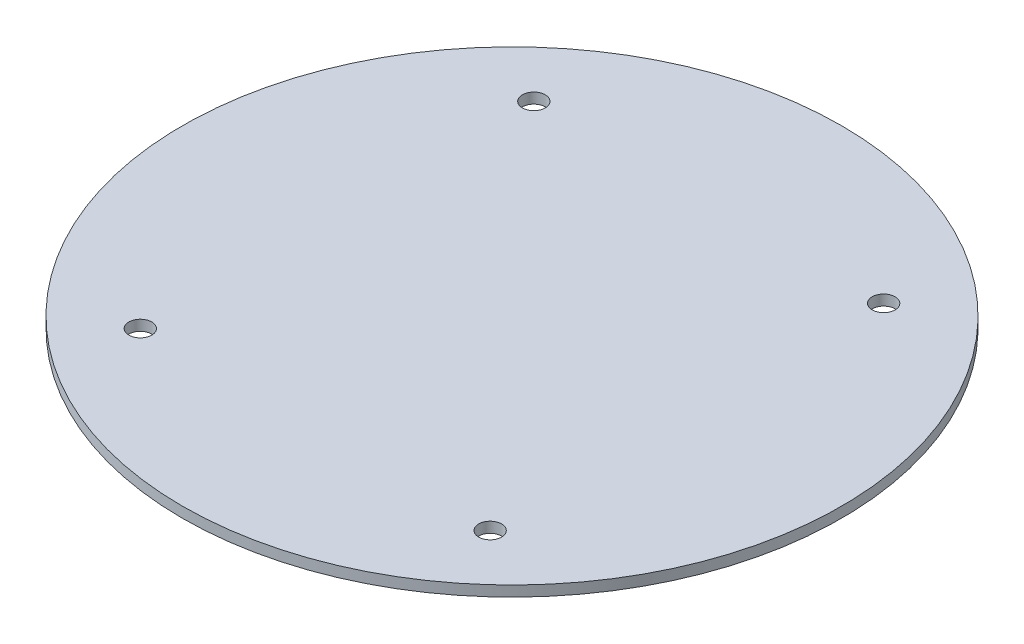
ISO-10303-21;
HEADER;
FILE_DESCRIPTION(('STEP AP214'),'2;1');
FILE_NAME('part.step','',(''),(''),'','','');
FILE_SCHEMA(('AUTOMOTIVE_DESIGN { 1 0 10303 214 1 1 1 1 }'));
ENDSEC;
DATA;
#1=APPLICATION_CONTEXT('core data for automotive mechanical design processes');
#2=APPLICATION_PROTOCOL_DEFINITION('international standard','automotive_design',2000,#1);
#3=PRODUCT_CONTEXT('',#1,'mechanical');
#4=PRODUCT('Part','Part','',(#3));
#5=PRODUCT_RELATED_PRODUCT_CATEGORY('part','',(#4));
#6=PRODUCT_DEFINITION_FORMATION('','',#4);
#7=PRODUCT_DEFINITION_CONTEXT('part definition',#1,'design');
#8=PRODUCT_DEFINITION('design','',#6,#7);
#9=PRODUCT_DEFINITION_SHAPE('','',#8);
#10=(LENGTH_UNIT() NAMED_UNIT(*) SI_UNIT(.MILLI.,.METRE.));
#11=(NAMED_UNIT(*) PLANE_ANGLE_UNIT() SI_UNIT($,.RADIAN.));
#12=(NAMED_UNIT(*) SI_UNIT($,.STERADIAN.) SOLID_ANGLE_UNIT());
#13=UNCERTAINTY_MEASURE_WITH_UNIT(LENGTH_MEASURE(1.E-05),#10,'distance_accuracy_value','');
#14=(GEOMETRIC_REPRESENTATION_CONTEXT(3) GLOBAL_UNCERTAINTY_ASSIGNED_CONTEXT((#13)) GLOBAL_UNIT_ASSIGNED_CONTEXT((#10,
#11,#12)) REPRESENTATION_CONTEXT('',''));
#15=CARTESIAN_POINT('',(0.,0.,0.));
#16=DIRECTION('',(0.,0.,1.));
#17=DIRECTION('',(1.,0.,0.));
#18=AXIS2_PLACEMENT_3D('',#15,#16,#17);
#19=CARTESIAN_POINT('',(0.,1.5875,0.));
#20=DIRECTION('',(0.,1.,0.));
#21=DIRECTION('',(0.,0.,1.));
#22=AXIS2_PLACEMENT_3D('',#19,#20,#21);
#23=PLANE('',#22);
#24=CARTESIAN_POINT('',(-26.42,1.5875,29.72));
#25=DIRECTION('',(0.,-1.,0.));
#26=DIRECTION('',(0.,0.,1.));
#27=AXIS2_PLACEMENT_3D('',#24,#25,#26);
#28=CIRCLE('',#27,1.7272);
#29=CARTESIAN_POINT('',(-26.42,1.5875,31.4472));
#30=VERTEX_POINT('',#29);
#31=EDGE_CURVE('E58',#30,#30,#28,.T.);
#32=ORIENTED_EDGE('',*,*,#31,.T.);
#33=EDGE_LOOP('',(#32));
#34=FACE_BOUND('',#33,.T.);
#35=CARTESIAN_POINT('',(26.42,1.5875,-29.72));
#36=DIRECTION('',(0.,1.,0.));
#37=DIRECTION('',(0.,0.,1.));
#38=AXIS2_PLACEMENT_3D('',#35,#36,#37);
#39=CIRCLE('',#38,1.7272);
#40=CARTESIAN_POINT('',(26.42,1.5875,-27.9928));
#41=VERTEX_POINT('',#40);
#42=EDGE_CURVE('E55',#41,#41,#39,.T.);
#43=ORIENTED_EDGE('',*,*,#42,.F.);
#44=EDGE_LOOP('',(#43));
#45=FACE_BOUND('',#44,.T.);
#46=CARTESIAN_POINT('',(26.42,1.5875,29.72));
#47=DIRECTION('',(0.,1.,0.));
#48=DIRECTION('',(0.,0.,1.));
#49=AXIS2_PLACEMENT_3D('',#46,#47,#48);
#50=CIRCLE('',#49,1.7272);
#51=CARTESIAN_POINT('',(26.42,1.5875,31.4472));
#52=VERTEX_POINT('',#51);
#53=EDGE_CURVE('E48',#52,#52,#50,.T.);
#54=ORIENTED_EDGE('',*,*,#53,.F.);
#55=EDGE_LOOP('',(#54));
#56=FACE_BOUND('',#55,.T.);
#57=CARTESIAN_POINT('',(0.,1.5875,0.));
#58=DIRECTION('',(0.,1.,0.));
#59=DIRECTION('',(0.,0.,1.));
#60=AXIS2_PLACEMENT_3D('',#57,#58,#59);
#61=CIRCLE('',#60,49.78);
#62=CARTESIAN_POINT('',(0.,1.5875,49.78));
#63=VERTEX_POINT('',#62);
#64=EDGE_CURVE('E10',#63,#63,#61,.T.);
#65=ORIENTED_EDGE('',*,*,#64,.T.);
#66=EDGE_LOOP('',(#65));
#67=FACE_BOUND('',#66,.T.);
#68=CARTESIAN_POINT('',(-26.42,1.5875,-29.72));
#69=DIRECTION('',(0.,-1.,0.));
#70=DIRECTION('',(0.,0.,1.));
#71=AXIS2_PLACEMENT_3D('',#68,#69,#70);
#72=CIRCLE('',#71,1.7272);
#73=CARTESIAN_POINT('',(-26.42,1.5875,-27.9928));
#74=VERTEX_POINT('',#73);
#75=EDGE_CURVE('E67',#74,#74,#72,.T.);
#76=ORIENTED_EDGE('',*,*,#75,.T.);
#77=EDGE_LOOP('',(#76));
#78=FACE_BOUND('',#77,.T.);
#79=ADVANCED_FACE('F32',(#34,#45,#56,#67,#78),#23,.T.);
#80=CARTESIAN_POINT('',(0.,0.,0.));
#81=DIRECTION('',(0.,1.,0.));
#82=DIRECTION('',(0.,0.,1.));
#83=AXIS2_PLACEMENT_3D('',#80,#81,#82);
#84=PLANE('',#83);
#85=CARTESIAN_POINT('',(-26.42,0.,29.72));
#86=DIRECTION('',(0.,1.,0.));
#87=DIRECTION('',(0.,0.,1.));
#88=AXIS2_PLACEMENT_3D('',#85,#86,#87);
#89=CIRCLE('',#88,1.7272);
#90=CARTESIAN_POINT('',(-26.42,0.,31.4472));
#91=VERTEX_POINT('',#90);
#92=EDGE_CURVE('E56',#91,#91,#89,.F.);
#93=ORIENTED_EDGE('',*,*,#92,.F.);
#94=EDGE_LOOP('',(#93));
#95=FACE_BOUND('',#94,.T.);
#96=CARTESIAN_POINT('',(26.42,0.,-29.72));
#97=DIRECTION('',(0.,1.,0.));
#98=DIRECTION('',(0.,0.,1.));
#99=AXIS2_PLACEMENT_3D('',#96,#97,#98);
#100=CIRCLE('',#99,1.7272);
#101=CARTESIAN_POINT('',(26.42,0.,-27.9928));
#102=VERTEX_POINT('',#101);
#103=EDGE_CURVE('E53',#102,#102,#100,.T.);
#104=ORIENTED_EDGE('',*,*,#103,.T.);
#105=EDGE_LOOP('',(#104));
#106=FACE_BOUND('',#105,.T.);
#107=CARTESIAN_POINT('',(26.42,0.,29.72));
#108=DIRECTION('',(0.,1.,0.));
#109=DIRECTION('',(0.,0.,1.));
#110=AXIS2_PLACEMENT_3D('',#107,#108,#109);
#111=CIRCLE('',#110,1.7272);
#112=CARTESIAN_POINT('',(26.42,0.,31.4472));
#113=VERTEX_POINT('',#112);
#114=EDGE_CURVE('E45',#113,#113,#111,.T.);
#115=ORIENTED_EDGE('',*,*,#114,.T.);
#116=EDGE_LOOP('',(#115));
#117=FACE_BOUND('',#116,.T.);
#118=CARTESIAN_POINT('',(0.,0.,0.));
#119=DIRECTION('',(0.,1.,0.));
#120=DIRECTION('',(0.,0.,1.));
#121=AXIS2_PLACEMENT_3D('',#118,#119,#120);
#122=CIRCLE('',#121,49.78);
#123=CARTESIAN_POINT('',(0.,0.,49.78));
#124=VERTEX_POINT('',#123);
#125=EDGE_CURVE('E40',#124,#124,#122,.T.);
#126=ORIENTED_EDGE('',*,*,#125,.F.);
#127=EDGE_LOOP('',(#126));
#128=FACE_BOUND('',#127,.T.);
#129=CARTESIAN_POINT('',(-26.42,0.,-29.72));
#130=DIRECTION('',(0.,1.,0.));
#131=DIRECTION('',(0.,0.,1.));
#132=AXIS2_PLACEMENT_3D('',#129,#130,#131);
#133=CIRCLE('',#132,1.7272);
#134=CARTESIAN_POINT('',(-26.42,0.,-27.9928));
#135=VERTEX_POINT('',#134);
#136=EDGE_CURVE('E36',#135,#135,#133,.F.);
#137=ORIENTED_EDGE('',*,*,#136,.F.);
#138=EDGE_LOOP('',(#137));
#139=FACE_BOUND('',#138,.T.);
#140=ADVANCED_FACE('F80',(#95,#106,#117,#128,#139),#84,.F.);
#141=CARTESIAN_POINT('',(0.,1.5875,0.));
#142=DIRECTION('',(0.,-1.,0.));
#143=DIRECTION('',(0.,0.,-1.));
#144=AXIS2_PLACEMENT_3D('',#141,#142,#143);
#145=CYLINDRICAL_SURFACE('',#144,49.78);
#146=ORIENTED_EDGE('',*,*,#64,.F.);
#147=EDGE_LOOP('',(#146));
#148=FACE_BOUND('',#147,.T.);
#149=ORIENTED_EDGE('',*,*,#125,.T.);
#150=EDGE_LOOP('',(#149));
#151=FACE_BOUND('',#150,.T.);
#152=ADVANCED_FACE('F34',(#148,#151),#145,.T.);
#153=CARTESIAN_POINT('',(26.42,-8.4125,29.72));
#154=DIRECTION('',(0.,1.,0.));
#155=DIRECTION('',(0.,0.,1.));
#156=AXIS2_PLACEMENT_3D('',#153,#154,#155);
#157=CYLINDRICAL_SURFACE('',#156,1.7272);
#158=ORIENTED_EDGE('',*,*,#53,.T.);
#159=EDGE_LOOP('',(#158));
#160=FACE_BOUND('',#159,.T.);
#161=ORIENTED_EDGE('',*,*,#114,.F.);
#162=EDGE_LOOP('',(#161));
#163=FACE_BOUND('',#162,.T.);
#164=ADVANCED_FACE('F87',(#160,#163),#157,.F.);
#165=CARTESIAN_POINT('',(26.42,-8.4125,-29.72));
#166=DIRECTION('',(0.,1.,0.));
#167=DIRECTION('',(0.,0.,1.));
#168=AXIS2_PLACEMENT_3D('',#165,#166,#167);
#169=CYLINDRICAL_SURFACE('',#168,1.7272);
#170=ORIENTED_EDGE('',*,*,#42,.T.);
#171=EDGE_LOOP('',(#170));
#172=FACE_BOUND('',#171,.T.);
#173=ORIENTED_EDGE('',*,*,#103,.F.);
#174=EDGE_LOOP('',(#173));
#175=FACE_BOUND('',#174,.T.);
#176=ADVANCED_FACE('F94',(#172,#175),#169,.F.);
#177=CARTESIAN_POINT('',(-26.42,-8.4125,29.72));
#178=DIRECTION('',(0.,1.,0.));
#179=DIRECTION('',(0.,0.,1.));
#180=AXIS2_PLACEMENT_3D('',#177,#178,#179);
#181=CYLINDRICAL_SURFACE('',#180,1.7272);
#182=ORIENTED_EDGE('',*,*,#31,.F.);
#183=EDGE_LOOP('',(#182));
#184=FACE_BOUND('',#183,.T.);
#185=ORIENTED_EDGE('',*,*,#92,.T.);
#186=EDGE_LOOP('',(#185));
#187=FACE_BOUND('',#186,.T.);
#188=ADVANCED_FACE('F76',(#184,#187),#181,.F.);
#189=CARTESIAN_POINT('',(-26.42,-8.4125,-29.72));
#190=DIRECTION('',(0.,1.,0.));
#191=DIRECTION('',(0.,0.,1.));
#192=AXIS2_PLACEMENT_3D('',#189,#190,#191);
#193=CYLINDRICAL_SURFACE('',#192,1.7272);
#194=ORIENTED_EDGE('',*,*,#75,.F.);
#195=EDGE_LOOP('',(#194));
#196=FACE_BOUND('',#195,.T.);
#197=ORIENTED_EDGE('',*,*,#136,.T.);
#198=EDGE_LOOP('',(#197));
#199=FACE_BOUND('',#198,.T.);
#200=ADVANCED_FACE('F73',(#196,#199),#193,.F.);
#201=CLOSED_SHELL('',(#79,#140,#152,#164,#176,#188,#200));
#202=MANIFOLD_SOLID_BREP('B2',#201);
#203=ADVANCED_BREP_SHAPE_REPRESENTATION('',(#18,#202),#14);
#204=SHAPE_DEFINITION_REPRESENTATION(#9,#203);
ENDSEC;
END-ISO-10303-21;
